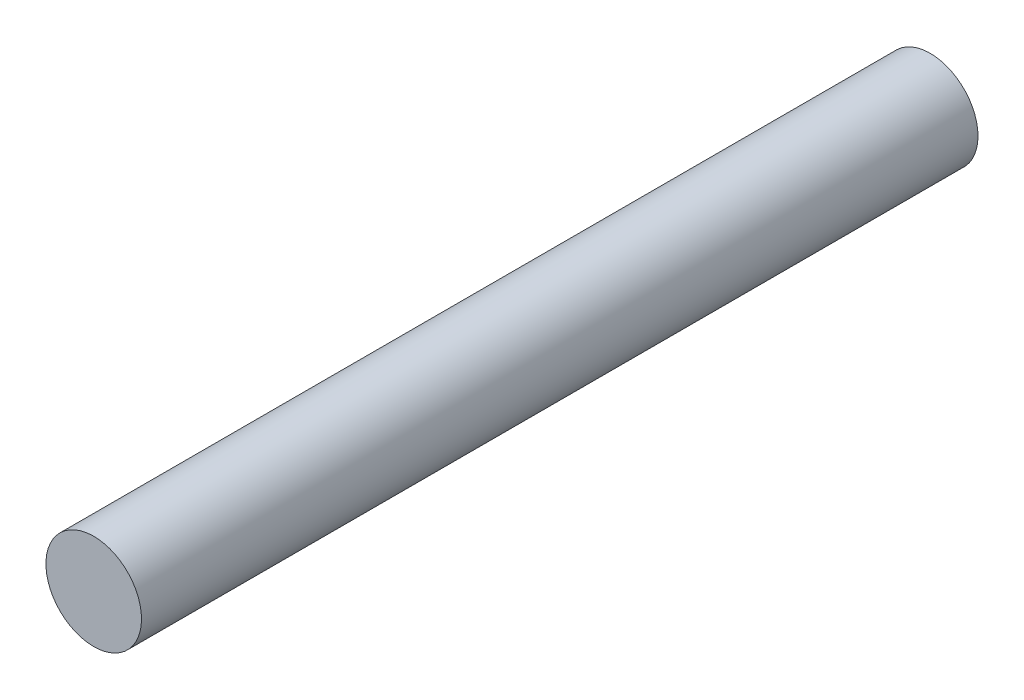
ISO-10303-21;
HEADER;
FILE_DESCRIPTION(('STEP AP214'),'2;1');
FILE_NAME('part.step','',(''),(''),'','','');
FILE_SCHEMA(('AUTOMOTIVE_DESIGN { 1 0 10303 214 1 1 1 1 }'));
ENDSEC;
DATA;
#1=APPLICATION_CONTEXT('core data for automotive mechanical design processes');
#2=APPLICATION_PROTOCOL_DEFINITION('international standard','automotive_design',2000,#1);
#3=PRODUCT_CONTEXT('',#1,'mechanical');
#4=PRODUCT('Part','Part','',(#3));
#5=PRODUCT_RELATED_PRODUCT_CATEGORY('part','',(#4));
#6=PRODUCT_DEFINITION_FORMATION('','',#4);
#7=PRODUCT_DEFINITION_CONTEXT('part definition',#1,'design');
#8=PRODUCT_DEFINITION('design','',#6,#7);
#9=PRODUCT_DEFINITION_SHAPE('','',#8);
#10=(LENGTH_UNIT() NAMED_UNIT(*) SI_UNIT(.MILLI.,.METRE.));
#11=(NAMED_UNIT(*) PLANE_ANGLE_UNIT() SI_UNIT($,.RADIAN.));
#12=(NAMED_UNIT(*) SI_UNIT($,.STERADIAN.) SOLID_ANGLE_UNIT());
#13=UNCERTAINTY_MEASURE_WITH_UNIT(LENGTH_MEASURE(1.E-05),#10,'distance_accuracy_value','');
#14=(GEOMETRIC_REPRESENTATION_CONTEXT(3) GLOBAL_UNCERTAINTY_ASSIGNED_CONTEXT((#13)) GLOBAL_UNIT_ASSIGNED_CONTEXT((#10,
#11,#12)) REPRESENTATION_CONTEXT('',''));
#15=CARTESIAN_POINT('',(0.,0.,0.));
#16=DIRECTION('',(0.,0.,1.));
#17=DIRECTION('',(1.,0.,0.));
#18=AXIS2_PLACEMENT_3D('',#15,#16,#17);
#19=CARTESIAN_POINT('',(0.,0.,70.));
#20=DIRECTION('',(0.,0.,-1.));
#21=DIRECTION('',(-1.,0.,0.));
#22=AXIS2_PLACEMENT_3D('',#19,#20,#21);
#23=CYLINDRICAL_SURFACE('',#22,4.);
#24=CARTESIAN_POINT('',(0.,0.,70.));
#25=DIRECTION('',(0.,0.,1.));
#26=DIRECTION('',(1.,0.,0.));
#27=AXIS2_PLACEMENT_3D('',#24,#25,#26);
#28=CIRCLE('',#27,4.);
#29=CARTESIAN_POINT('',(4.,0.,70.));
#30=VERTEX_POINT('',#29);
#31=EDGE_CURVE('E10',#30,#30,#28,.T.);
#32=ORIENTED_EDGE('',*,*,#31,.F.);
#33=EDGE_LOOP('',(#32));
#34=FACE_BOUND('',#33,.T.);
#35=CARTESIAN_POINT('',(0.,0.,0.));
#36=DIRECTION('',(0.,0.,1.));
#37=DIRECTION('',(1.,0.,0.));
#38=AXIS2_PLACEMENT_3D('',#35,#36,#37);
#39=CIRCLE('',#38,4.);
#40=CARTESIAN_POINT('',(4.,0.,0.));
#41=VERTEX_POINT('',#40);
#42=EDGE_CURVE('E46',#41,#41,#39,.T.);
#43=ORIENTED_EDGE('',*,*,#42,.T.);
#44=EDGE_LOOP('',(#43));
#45=FACE_BOUND('',#44,.T.);
#46=ADVANCED_FACE('F43',(#34,#45),#23,.T.);
#47=CARTESIAN_POINT('',(0.,0.,70.));
#48=DIRECTION('',(0.,0.,1.));
#49=DIRECTION('',(1.,0.,0.));
#50=AXIS2_PLACEMENT_3D('',#47,#48,#49);
#51=PLANE('',#50);
#52=ORIENTED_EDGE('',*,*,#31,.T.);
#53=EDGE_LOOP('',(#52));
#54=FACE_BOUND('',#53,.T.);
#55=ADVANCED_FACE('F60',(#54),#51,.T.);
#56=CARTESIAN_POINT('',(0.,0.,0.));
#57=DIRECTION('',(0.,0.,1.));
#58=DIRECTION('',(1.,0.,0.));
#59=AXIS2_PLACEMENT_3D('',#56,#57,#58);
#60=PLANE('',#59);
#61=ORIENTED_EDGE('',*,*,#42,.F.);
#62=EDGE_LOOP('',(#61));
#63=FACE_BOUND('',#62,.T.);
#64=ADVANCED_FACE('F58',(#63),#60,.F.);
#65=CLOSED_SHELL('',(#46,#55,#64));
#66=MANIFOLD_SOLID_BREP('B2',#65);
#67=ADVANCED_BREP_SHAPE_REPRESENTATION('',(#18,#66),#14);
#68=SHAPE_DEFINITION_REPRESENTATION(#9,#67);
ENDSEC;
END-ISO-10303-21;
